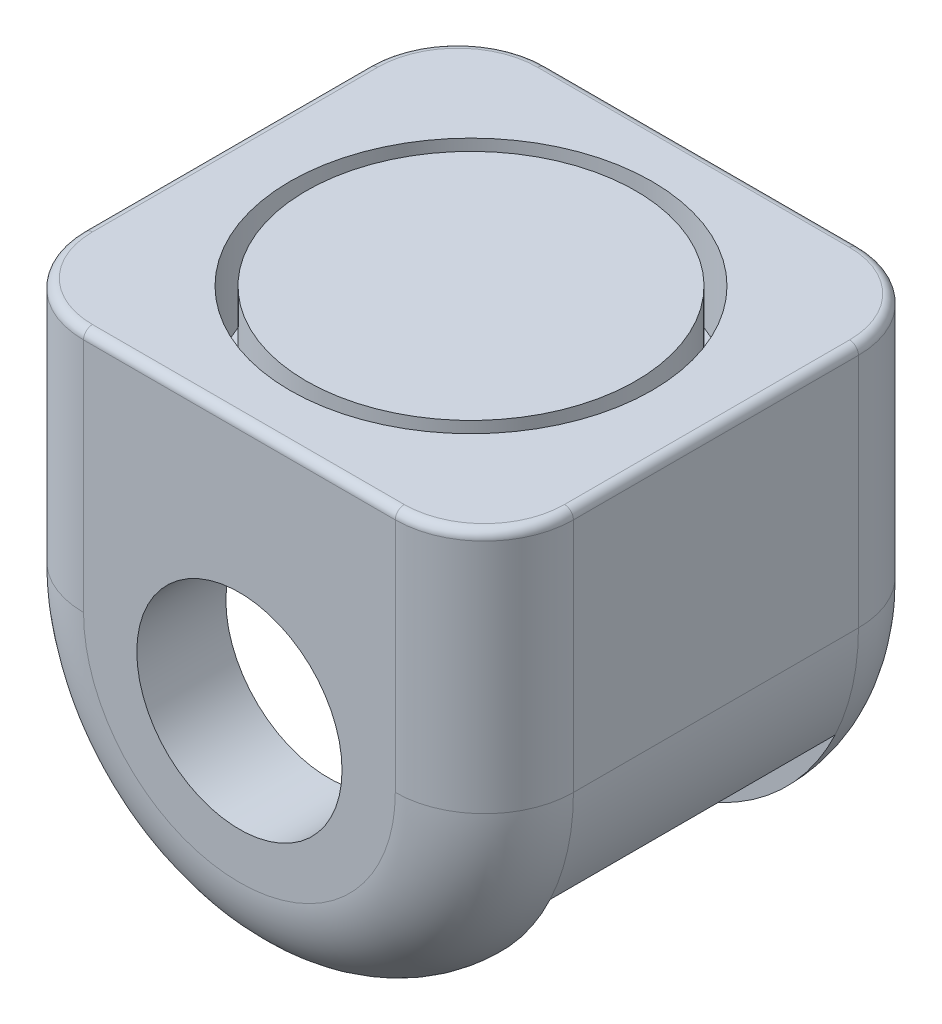
ISO-10303-21;
HEADER;
FILE_DESCRIPTION(('STEP AP214'),'2;1');
FILE_NAME('part.step','',(''),(''),'','','');
FILE_SCHEMA(('AUTOMOTIVE_DESIGN { 1 0 10303 214 1 1 1 1 }'));
ENDSEC;
DATA;
#1=APPLICATION_CONTEXT('core data for automotive mechanical design processes');
#2=APPLICATION_PROTOCOL_DEFINITION('international standard','automotive_design',2000,#1);
#3=PRODUCT_CONTEXT('',#1,'mechanical');
#4=PRODUCT('Part','Part','',(#3));
#5=PRODUCT_RELATED_PRODUCT_CATEGORY('part','',(#4));
#6=PRODUCT_DEFINITION_FORMATION('','',#4);
#7=PRODUCT_DEFINITION_CONTEXT('part definition',#1,'design');
#8=PRODUCT_DEFINITION('design','',#6,#7);
#9=PRODUCT_DEFINITION_SHAPE('','',#8);
#10=(LENGTH_UNIT() NAMED_UNIT(*) SI_UNIT(.MILLI.,.METRE.));
#11=(NAMED_UNIT(*) PLANE_ANGLE_UNIT() SI_UNIT($,.RADIAN.));
#12=(NAMED_UNIT(*) SI_UNIT($,.STERADIAN.) SOLID_ANGLE_UNIT());
#13=UNCERTAINTY_MEASURE_WITH_UNIT(LENGTH_MEASURE(1.E-05),#10,'distance_accuracy_value','');
#14=(GEOMETRIC_REPRESENTATION_CONTEXT(3) GLOBAL_UNCERTAINTY_ASSIGNED_CONTEXT((#13)) GLOBAL_UNIT_ASSIGNED_CONTEXT((#10,
#11,#12)) REPRESENTATION_CONTEXT('',''));
#15=CARTESIAN_POINT('',(0.,0.,0.));
#16=DIRECTION('',(0.,0.,1.));
#17=DIRECTION('',(1.,0.,0.));
#18=AXIS2_PLACEMENT_3D('',#15,#16,#17);
#19=CARTESIAN_POINT('',(0.,-27.5,26.));
#20=DIRECTION('',(0.,0.,-1.));
#21=DIRECTION('',(-1.,0.,0.));
#22=AXIS2_PLACEMENT_3D('',#19,#20,#21);
#23=CYLINDRICAL_SURFACE('',#22,27.5);
#24=CARTESIAN_POINT('',(0.,-27.5,-16.));
#25=DIRECTION('',(0.,0.,1.));
#26=DIRECTION('',(1.,0.,0.));
#27=AXIS2_PLACEMENT_3D('',#24,#25,#26);
#28=CIRCLE('',#27,27.5);
#29=CARTESIAN_POINT('',(-27.5,-27.5,-16.));
#30=VERTEX_POINT('',#29);
#31=CARTESIAN_POINT('',(-24.9070429299363,-39.1571528464849,-16.));
#32=VERTEX_POINT('',#31);
#33=EDGE_CURVE('E273',#30,#32,#28,.T.);
#34=ORIENTED_EDGE('',*,*,#33,.T.);
#35=DIRECTION('',(0.,0.,1.));
#36=VECTOR('',#35,1.);
#37=CARTESIAN_POINT('',(-24.9070429299363,-39.1571528464849,0.));
#38=LINE('',#37,#36);
#39=CARTESIAN_POINT('',(-24.9070429299363,-39.1571528464849,16.));
#40=VERTEX_POINT('',#39);
#41=EDGE_CURVE('E232',#32,#40,#38,.T.);
#42=ORIENTED_EDGE('',*,*,#41,.T.);
#43=CARTESIAN_POINT('',(0.,-27.5,16.));
#44=DIRECTION('',(0.,0.,1.));
#45=DIRECTION('',(1.,0.,0.));
#46=AXIS2_PLACEMENT_3D('',#43,#44,#45);
#47=CIRCLE('',#46,27.5);
#48=CARTESIAN_POINT('',(-27.5,-27.5,16.));
#49=VERTEX_POINT('',#48);
#50=EDGE_CURVE('E267',#40,#49,#47,.F.);
#51=ORIENTED_EDGE('',*,*,#50,.T.);
#52=DIRECTION('',(0.,0.,-1.));
#53=VECTOR('',#52,1.);
#54=CARTESIAN_POINT('',(-27.5,-27.5,26.));
#55=LINE('',#54,#53);
#56=EDGE_CURVE('E243',#49,#30,#55,.T.);
#57=ORIENTED_EDGE('',*,*,#56,.T.);
#58=EDGE_LOOP('',(#34,#42,#51,#57));
#59=FACE_BOUND('',#58,.T.);
#60=ADVANCED_FACE('F57',(#59),#23,.T.);
#61=CARTESIAN_POINT('',(27.5,-27.5,16.));
#62=VERTEX_POINT('',#61);
#63=CARTESIAN_POINT('',(24.8788818448915,-39.2171343829422,16.));
#64=VERTEX_POINT('',#63);
#65=EDGE_CURVE('E268',#62,#64,#47,.F.);
#66=ORIENTED_EDGE('',*,*,#65,.T.);
#67=DIRECTION('',(0.,0.,1.));
#68=VECTOR('',#67,1.);
#69=CARTESIAN_POINT('',(24.8788818448915,-39.2171343829422,0.));
#70=LINE('',#69,#68);
#71=CARTESIAN_POINT('',(24.8788818448915,-39.2171343829422,-16.));
#72=VERTEX_POINT('',#71);
#73=EDGE_CURVE('E225',#64,#72,#70,.F.);
#74=ORIENTED_EDGE('',*,*,#73,.T.);
#75=CARTESIAN_POINT('',(27.5,-27.5,-16.));
#76=VERTEX_POINT('',#75);
#77=EDGE_CURVE('E271',#72,#76,#28,.T.);
#78=ORIENTED_EDGE('',*,*,#77,.T.);
#79=DIRECTION('',(0.,0.,-1.));
#80=VECTOR('',#79,1.);
#81=CARTESIAN_POINT('',(27.5,-27.5,26.));
#82=LINE('',#81,#80);
#83=EDGE_CURVE('E252',#62,#76,#82,.T.);
#84=ORIENTED_EDGE('',*,*,#83,.F.);
#85=EDGE_LOOP('',(#66,#74,#78,#84));
#86=FACE_BOUND('',#85,.T.);
#87=ADVANCED_FACE('F419',(#86),#23,.T.);
#88=CARTESIAN_POINT('',(27.5,0.,26.));
#89=DIRECTION('',(-1.,0.,0.));
#90=DIRECTION('',(0.,-1.,0.));
#91=AXIS2_PLACEMENT_3D('',#88,#89,#90);
#92=PLANE('',#91);
#93=DIRECTION('',(0.,1.,0.));
#94=VECTOR('',#93,1.);
#95=CARTESIAN_POINT('',(27.5,0.,-16.));
#96=LINE('',#95,#94);
#97=CARTESIAN_POINT('',(27.5,-1.,-16.));
#98=VERTEX_POINT('',#97);
#99=EDGE_CURVE('E257',#76,#98,#96,.T.);
#100=ORIENTED_EDGE('',*,*,#99,.T.);
#101=DIRECTION('',(0.,0.,-1.));
#102=VECTOR('',#101,1.);
#103=CARTESIAN_POINT('',(27.5,-1.,26.));
#104=LINE('',#103,#102);
#105=CARTESIAN_POINT('',(27.5,-1.,16.));
#106=VERTEX_POINT('',#105);
#107=EDGE_CURVE('E66',#98,#106,#104,.F.);
#108=ORIENTED_EDGE('',*,*,#107,.T.);
#109=DIRECTION('',(0.,1.,0.));
#110=VECTOR('',#109,1.);
#111=CARTESIAN_POINT('',(27.5,-27.5,16.));
#112=LINE('',#111,#110);
#113=EDGE_CURVE('E255',#106,#62,#112,.F.);
#114=ORIENTED_EDGE('',*,*,#113,.T.);
#115=ORIENTED_EDGE('',*,*,#83,.T.);
#116=EDGE_LOOP('',(#100,#108,#114,#115));
#117=FACE_BOUND('',#116,.T.);
#118=ADVANCED_FACE('F365',(#117),#92,.F.);
#119=CARTESIAN_POINT('',(-27.5,0.,26.));
#120=DIRECTION('',(0.,-1.,0.));
#121=DIRECTION('',(0.,0.,-1.));
#122=AXIS2_PLACEMENT_3D('',#119,#120,#121);
#123=PLANE('',#122);
#124=CARTESIAN_POINT('',(-17.5,0.,16.));
#125=DIRECTION('',(0.,-1.,0.));
#126=DIRECTION('',(0.,0.,-1.));
#127=AXIS2_PLACEMENT_3D('',#124,#125,#126);
#128=CIRCLE('',#127,9.);
#129=CARTESIAN_POINT('',(-26.5,0.,16.));
#130=VERTEX_POINT('',#129);
#131=CARTESIAN_POINT('',(-17.5,0.,25.));
#132=VERTEX_POINT('',#131);
#133=EDGE_CURVE('E308',#130,#132,#128,.F.);
#134=ORIENTED_EDGE('',*,*,#133,.T.);
#135=DIRECTION('',(-1.,0.,0.));
#136=VECTOR('',#135,1.);
#137=CARTESIAN_POINT('',(17.5,0.,25.));
#138=LINE('',#137,#136);
#139=CARTESIAN_POINT('',(17.5,0.,25.));
#140=VERTEX_POINT('',#139);
#141=EDGE_CURVE('E315',#132,#140,#138,.F.);
#142=ORIENTED_EDGE('',*,*,#141,.T.);
#143=CARTESIAN_POINT('',(17.5,0.,16.));
#144=DIRECTION('',(0.,-1.,0.));
#145=DIRECTION('',(0.,0.,-1.));
#146=AXIS2_PLACEMENT_3D('',#143,#144,#145);
#147=CIRCLE('',#146,9.);
#148=CARTESIAN_POINT('',(26.5,0.,16.));
#149=VERTEX_POINT('',#148);
#150=EDGE_CURVE('E313',#140,#149,#147,.F.);
#151=ORIENTED_EDGE('',*,*,#150,.T.);
#152=DIRECTION('',(0.,0.,-1.));
#153=VECTOR('',#152,1.);
#154=CARTESIAN_POINT('',(26.5,0.,26.));
#155=LINE('',#154,#153);
#156=CARTESIAN_POINT('',(26.5,0.,-16.));
#157=VERTEX_POINT('',#156);
#158=EDGE_CURVE('E311',#149,#157,#155,.T.);
#159=ORIENTED_EDGE('',*,*,#158,.T.);
#160=CARTESIAN_POINT('',(17.5,0.,-16.));
#161=DIRECTION('',(0.,-1.,0.));
#162=DIRECTION('',(0.,0.,-1.));
#163=AXIS2_PLACEMENT_3D('',#160,#161,#162);
#164=CIRCLE('',#163,9.);
#165=CARTESIAN_POINT('',(17.5,0.,-25.));
#166=VERTEX_POINT('',#165);
#167=EDGE_CURVE('E306',#157,#166,#164,.F.);
#168=ORIENTED_EDGE('',*,*,#167,.T.);
#169=DIRECTION('',(-1.,0.,0.));
#170=VECTOR('',#169,1.);
#171=CARTESIAN_POINT('',(-27.5,0.,-25.));
#172=LINE('',#171,#170);
#173=CARTESIAN_POINT('',(-17.5,0.,-25.));
#174=VERTEX_POINT('',#173);
#175=EDGE_CURVE('E304',#166,#174,#172,.T.);
#176=ORIENTED_EDGE('',*,*,#175,.T.);
#177=CARTESIAN_POINT('',(-17.5,0.,-16.));
#178=DIRECTION('',(0.,-1.,0.));
#179=DIRECTION('',(0.,0.,-1.));
#180=AXIS2_PLACEMENT_3D('',#177,#178,#179);
#181=CIRCLE('',#180,9.);
#182=CARTESIAN_POINT('',(-26.5,0.,-16.));
#183=VERTEX_POINT('',#182);
#184=EDGE_CURVE('E302',#174,#183,#181,.F.);
#185=ORIENTED_EDGE('',*,*,#184,.T.);
#186=DIRECTION('',(0.,0.,-1.));
#187=VECTOR('',#186,1.);
#188=CARTESIAN_POINT('',(-26.5,0.,26.));
#189=LINE('',#188,#187);
#190=EDGE_CURVE('E288',#183,#130,#189,.F.);
#191=ORIENTED_EDGE('',*,*,#190,.T.);
#192=EDGE_LOOP('',(#134,#142,#151,#159,#168,#176,#185,#191));
#193=FACE_BOUND('',#192,.T.);
#194=CARTESIAN_POINT('',(0.,0.,0.));
#195=DIRECTION('',(0.,1.,0.));
#196=DIRECTION('',(0.,0.,1.));
#197=AXIS2_PLACEMENT_3D('',#194,#195,#196);
#198=CIRCLE('',#197,20.325);
#199=CARTESIAN_POINT('',(0.,0.,20.325));
#200=VERTEX_POINT('',#199);
#201=EDGE_CURVE('E244',#200,#200,#198,.T.);
#202=ORIENTED_EDGE('',*,*,#201,.F.);
#203=EDGE_LOOP('',(#202));
#204=FACE_BOUND('',#203,.T.);
#205=ADVANCED_FACE('F394',(#193,#204),#123,.F.);
#206=CARTESIAN_POINT('',(-27.5,-27.5,26.));
#207=DIRECTION('',(1.,0.,0.));
#208=DIRECTION('',(0.,1.,0.));
#209=AXIS2_PLACEMENT_3D('',#206,#207,#208);
#210=PLANE('',#209);
#211=DIRECTION('',(0.,-1.,0.));
#212=VECTOR('',#211,1.);
#213=CARTESIAN_POINT('',(-27.5,0.,16.));
#214=LINE('',#213,#212);
#215=CARTESIAN_POINT('',(-27.5,-1.,16.));
#216=VERTEX_POINT('',#215);
#217=EDGE_CURVE('E284',#49,#216,#214,.F.);
#218=ORIENTED_EDGE('',*,*,#217,.T.);
#219=DIRECTION('',(0.,0.,-1.));
#220=VECTOR('',#219,1.);
#221=CARTESIAN_POINT('',(-27.5,-1.,26.));
#222=LINE('',#221,#220);
#223=CARTESIAN_POINT('',(-27.5,-1.,-16.));
#224=VERTEX_POINT('',#223);
#225=EDGE_CURVE('E12',#216,#224,#222,.T.);
#226=ORIENTED_EDGE('',*,*,#225,.T.);
#227=DIRECTION('',(0.,-1.,0.));
#228=VECTOR('',#227,1.);
#229=CARTESIAN_POINT('',(-27.5,-27.5,-16.));
#230=LINE('',#229,#228);
#231=EDGE_CURVE('E286',#224,#30,#230,.T.);
#232=ORIENTED_EDGE('',*,*,#231,.T.);
#233=ORIENTED_EDGE('',*,*,#56,.F.);
#234=EDGE_LOOP('',(#218,#226,#232,#233));
#235=FACE_BOUND('',#234,.T.);
#236=ADVANCED_FACE('F427',(#235),#210,.F.);
#237=CARTESIAN_POINT('',(0.,-27.5,26.));
#238=DIRECTION('',(0.,0.,1.));
#239=DIRECTION('',(1.,0.,0.));
#240=AXIS2_PLACEMENT_3D('',#237,#238,#239);
#241=PLANE('',#240);
#242=CARTESIAN_POINT('',(0.,-28.3193180245492,26.));
#243=DIRECTION('',(0.,0.,1.));
#244=DIRECTION('',(1.,0.,0.));
#245=AXIS2_PLACEMENT_3D('',#242,#243,#244);
#246=CIRCLE('',#245,11.52);
#247=CARTESIAN_POINT('',(11.52,-28.3193180245492,26.));
#248=VERTEX_POINT('',#247);
#249=EDGE_CURVE('E746',#248,#248,#246,.T.);
#250=ORIENTED_EDGE('',*,*,#249,.F.);
#251=EDGE_LOOP('',(#250));
#252=FACE_BOUND('',#251,.T.);
#253=DIRECTION('',(0.,1.,0.));
#254=VECTOR('',#253,1.);
#255=CARTESIAN_POINT('',(17.5,0.,26.));
#256=LINE('',#255,#254);
#257=CARTESIAN_POINT('',(17.5,-27.5,26.));
#258=VERTEX_POINT('',#257);
#259=CARTESIAN_POINT('',(17.5,-1.,26.));
#260=VERTEX_POINT('',#259);
#261=EDGE_CURVE('E281',#258,#260,#256,.T.);
#262=ORIENTED_EDGE('',*,*,#261,.T.);
#263=DIRECTION('',(-1.,0.,0.));
#264=VECTOR('',#263,1.);
#265=CARTESIAN_POINT('',(-17.5,-1.,26.));
#266=LINE('',#265,#264);
#267=CARTESIAN_POINT('',(-17.5,-1.,26.));
#268=VERTEX_POINT('',#267);
#269=EDGE_CURVE('E320',#260,#268,#266,.T.);
#270=ORIENTED_EDGE('',*,*,#269,.T.);
#271=DIRECTION('',(0.,-1.,0.));
#272=VECTOR('',#271,1.);
#273=CARTESIAN_POINT('',(-17.5,-27.5,26.));
#274=LINE('',#273,#272);
#275=CARTESIAN_POINT('',(-17.5,-27.5,26.));
#276=VERTEX_POINT('',#275);
#277=EDGE_CURVE('E276',#268,#276,#274,.T.);
#278=ORIENTED_EDGE('',*,*,#277,.T.);
#279=CARTESIAN_POINT('',(0.,-27.5,26.));
#280=DIRECTION('',(0.,0.,1.));
#281=DIRECTION('',(1.,0.,0.));
#282=AXIS2_PLACEMENT_3D('',#279,#280,#281);
#283=CIRCLE('',#282,17.5);
#284=EDGE_CURVE('E279',#276,#258,#283,.T.);
#285=ORIENTED_EDGE('',*,*,#284,.T.);
#286=EDGE_LOOP('',(#262,#270,#278,#285));
#287=FACE_BOUND('',#286,.T.);
#288=ADVANCED_FACE('F410',(#252,#287),#241,.T.);
#289=CARTESIAN_POINT('',(0.,-27.5,-26.));
#290=DIRECTION('',(0.,0.,1.));
#291=DIRECTION('',(1.,0.,0.));
#292=AXIS2_PLACEMENT_3D('',#289,#290,#291);
#293=PLANE('',#292);
#294=CARTESIAN_POINT('',(0.,-28.3193180245492,-26.));
#295=DIRECTION('',(0.,0.,1.));
#296=DIRECTION('',(1.,0.,0.));
#297=AXIS2_PLACEMENT_3D('',#294,#295,#296);
#298=CIRCLE('',#297,11.52);
#299=CARTESIAN_POINT('',(11.52,-28.3193180245492,-26.));
#300=VERTEX_POINT('',#299);
#301=EDGE_CURVE('E216',#300,#300,#298,.T.);
#302=ORIENTED_EDGE('',*,*,#301,.T.);
#303=EDGE_LOOP('',(#302));
#304=FACE_BOUND('',#303,.T.);
#305=DIRECTION('',(0.,-1.,0.));
#306=VECTOR('',#305,1.);
#307=CARTESIAN_POINT('',(-17.5,-27.5,-26.));
#308=LINE('',#307,#306);
#309=CARTESIAN_POINT('',(-17.5,-27.5,-26.));
#310=VERTEX_POINT('',#309);
#311=CARTESIAN_POINT('',(-17.5,-1.,-26.));
#312=VERTEX_POINT('',#311);
#313=EDGE_CURVE('E260',#310,#312,#308,.F.);
#314=ORIENTED_EDGE('',*,*,#313,.T.);
#315=DIRECTION('',(-1.,0.,0.));
#316=VECTOR('',#315,1.);
#317=CARTESIAN_POINT('',(0.,-1.,-26.));
#318=LINE('',#317,#316);
#319=CARTESIAN_POINT('',(17.5,-1.,-26.));
#320=VERTEX_POINT('',#319);
#321=EDGE_CURVE('E326',#312,#320,#318,.F.);
#322=ORIENTED_EDGE('',*,*,#321,.T.);
#323=DIRECTION('',(0.,1.,0.));
#324=VECTOR('',#323,1.);
#325=CARTESIAN_POINT('',(17.5,-27.5,-26.));
#326=LINE('',#325,#324);
#327=CARTESIAN_POINT('',(17.5,-27.5,-26.));
#328=VERTEX_POINT('',#327);
#329=EDGE_CURVE('E265',#320,#328,#326,.F.);
#330=ORIENTED_EDGE('',*,*,#329,.T.);
#331=CARTESIAN_POINT('',(0.,-27.5,-26.));
#332=DIRECTION('',(0.,0.,1.));
#333=DIRECTION('',(1.,0.,0.));
#334=AXIS2_PLACEMENT_3D('',#331,#332,#333);
#335=CIRCLE('',#334,17.5);
#336=EDGE_CURVE('E263',#328,#310,#335,.F.);
#337=ORIENTED_EDGE('',*,*,#336,.T.);
#338=EDGE_LOOP('',(#314,#322,#330,#337));
#339=FACE_BOUND('',#338,.T.);
#340=ADVANCED_FACE('F380',(#304,#339),#293,.F.);
#341=CARTESIAN_POINT('',(0.,-10.,0.));
#342=DIRECTION('',(0.,1.,0.));
#343=DIRECTION('',(0.,0.,1.));
#344=AXIS2_PLACEMENT_3D('',#341,#342,#343);
#345=CYLINDRICAL_SURFACE('',#344,18.5);
#346=CARTESIAN_POINT('',(0.,-10.,0.));
#347=DIRECTION('',(0.,1.,0.));
#348=DIRECTION('',(0.,0.,1.));
#349=AXIS2_PLACEMENT_3D('',#346,#347,#348);
#350=CIRCLE('',#349,18.5);
#351=CARTESIAN_POINT('',(0.,-10.,18.5));
#352=VERTEX_POINT('',#351);
#353=EDGE_CURVE('E239',#352,#352,#350,.T.);
#354=ORIENTED_EDGE('',*,*,#353,.T.);
#355=EDGE_LOOP('',(#354));
#356=FACE_BOUND('',#355,.T.);
#357=CARTESIAN_POINT('',(0.,0.,0.));
#358=DIRECTION('',(0.,1.,0.));
#359=DIRECTION('',(0.,0.,1.));
#360=AXIS2_PLACEMENT_3D('',#357,#358,#359);
#361=CIRCLE('',#360,18.5);
#362=CARTESIAN_POINT('',(0.,0.,18.5));
#363=VERTEX_POINT('',#362);
#364=EDGE_CURVE('E240',#363,#363,#361,.T.);
#365=ORIENTED_EDGE('',*,*,#364,.F.);
#366=EDGE_LOOP('',(#365));
#367=FACE_BOUND('',#366,.T.);
#368=ADVANCED_FACE('F533',(#356,#367),#345,.T.);
#369=CARTESIAN_POINT('',(0.,-10.,0.));
#370=DIRECTION('',(0.,1.,0.));
#371=DIRECTION('',(0.,0.,1.));
#372=AXIS2_PLACEMENT_3D('',#369,#370,#371);
#373=CYLINDRICAL_SURFACE('',#372,20.325);
#374=CARTESIAN_POINT('',(0.,-10.,0.));
#375=DIRECTION('',(0.,1.,0.));
#376=DIRECTION('',(0.,0.,1.));
#377=AXIS2_PLACEMENT_3D('',#374,#375,#376);
#378=CIRCLE('',#377,20.325);
#379=CARTESIAN_POINT('',(0.,-10.,20.325));
#380=VERTEX_POINT('',#379);
#381=EDGE_CURVE('E236',#380,#380,#378,.T.);
#382=ORIENTED_EDGE('',*,*,#381,.F.);
#383=EDGE_LOOP('',(#382));
#384=FACE_BOUND('',#383,.T.);
#385=ORIENTED_EDGE('',*,*,#201,.T.);
#386=EDGE_LOOP('',(#385));
#387=FACE_BOUND('',#386,.T.);
#388=ADVANCED_FACE('F525',(#384,#387),#373,.F.);
#389=CARTESIAN_POINT('',(0.,-10.,0.));
#390=DIRECTION('',(0.,1.,0.));
#391=DIRECTION('',(0.,0.,1.));
#392=AXIS2_PLACEMENT_3D('',#389,#390,#391);
#393=PLANE('',#392);
#394=ORIENTED_EDGE('',*,*,#381,.T.);
#395=EDGE_LOOP('',(#394));
#396=FACE_BOUND('',#395,.T.);
#397=ORIENTED_EDGE('',*,*,#353,.F.);
#398=EDGE_LOOP('',(#397));
#399=FACE_BOUND('',#398,.T.);
#400=ADVANCED_FACE('F517',(#396,#399),#393,.T.);
#401=ORIENTED_EDGE('',*,*,#364,.T.);
#402=EDGE_LOOP('',(#401));
#403=FACE_BOUND('',#402,.T.);
#404=ADVANCED_FACE('F462',(#403),#123,.F.);
#405=CARTESIAN_POINT('',(-17.5,-27.5,-16.));
#406=DIRECTION('',(0.,-1.,0.));
#407=DIRECTION('',(1.,0.,0.));
#408=AXIS2_PLACEMENT_3D('',#405,#406,#407);
#409=CYLINDRICAL_SURFACE('',#408,10.);
#410=ORIENTED_EDGE('',*,*,#231,.F.);
#411=CARTESIAN_POINT('',(-17.5,-1.,-16.));
#412=DIRECTION('',(0.,-1.,0.));
#413=DIRECTION('',(0.,0.,-1.));
#414=AXIS2_PLACEMENT_3D('',#411,#412,#413);
#415=CIRCLE('',#414,10.);
#416=EDGE_CURVE('E328',#224,#312,#415,.T.);
#417=ORIENTED_EDGE('',*,*,#416,.T.);
#418=ORIENTED_EDGE('',*,*,#313,.F.);
#419=CARTESIAN_POINT('',(-17.5,-27.5,-16.));
#420=DIRECTION('',(0.,-1.,0.));
#421=DIRECTION('',(0.,0.,-1.));
#422=AXIS2_PLACEMENT_3D('',#419,#420,#421);
#423=CIRCLE('',#422,10.);
#424=EDGE_CURVE('E247',#30,#310,#423,.T.);
#425=ORIENTED_EDGE('',*,*,#424,.F.);
#426=EDGE_LOOP('',(#410,#417,#418,#425));
#427=FACE_BOUND('',#426,.T.);
#428=ADVANCED_FACE('F382',(#427),#409,.T.);
#429=CARTESIAN_POINT('',(0.,-27.5,-16.));
#430=DIRECTION('',(0.,0.,1.));
#431=DIRECTION('',(1.,0.,0.));
#432=AXIS2_PLACEMENT_3D('',#429,#430,#431);
#433=TOROIDAL_SURFACE('',#432,17.5,10.);
#434=ORIENTED_EDGE('',*,*,#424,.T.);
#435=ORIENTED_EDGE('',*,*,#336,.F.);
#436=CARTESIAN_POINT('',(17.5,-27.5,-16.));
#437=DIRECTION('',(0.,1.,0.));
#438=DIRECTION('',(0.,0.,1.));
#439=AXIS2_PLACEMENT_3D('',#436,#437,#438);
#440=CIRCLE('',#439,10.);
#441=EDGE_CURVE('E289',#76,#328,#440,.T.);
#442=ORIENTED_EDGE('',*,*,#441,.F.);
#443=ORIENTED_EDGE('',*,*,#77,.F.);
#444=EDGE_CURVE('E277',#32,#72,#28,.T.);
#445=ORIENTED_EDGE('',*,*,#444,.F.);
#446=ORIENTED_EDGE('',*,*,#33,.F.);
#447=EDGE_LOOP('',(#434,#435,#442,#443,#445,#446));
#448=FACE_BOUND('',#447,.T.);
#449=ADVANCED_FACE('F374',(#448),#433,.T.);
#450=CARTESIAN_POINT('',(17.5,0.,-16.));
#451=DIRECTION('',(0.,1.,0.));
#452=DIRECTION('',(-1.,0.,0.));
#453=AXIS2_PLACEMENT_3D('',#450,#451,#452);
#454=CYLINDRICAL_SURFACE('',#453,10.);
#455=ORIENTED_EDGE('',*,*,#329,.F.);
#456=CARTESIAN_POINT('',(17.5,-1.,-16.));
#457=DIRECTION('',(0.,-1.,0.));
#458=DIRECTION('',(0.,0.,-1.));
#459=AXIS2_PLACEMENT_3D('',#456,#457,#458);
#460=CIRCLE('',#459,10.);
#461=EDGE_CURVE('E324',#320,#98,#460,.T.);
#462=ORIENTED_EDGE('',*,*,#461,.T.);
#463=ORIENTED_EDGE('',*,*,#99,.F.);
#464=ORIENTED_EDGE('',*,*,#441,.T.);
#465=EDGE_LOOP('',(#455,#462,#463,#464));
#466=FACE_BOUND('',#465,.T.);
#467=ADVANCED_FACE('F363',(#466),#454,.T.);
#468=CARTESIAN_POINT('',(-17.5,-27.5,16.));
#469=DIRECTION('',(0.,1.,0.));
#470=DIRECTION('',(-1.,0.,0.));
#471=AXIS2_PLACEMENT_3D('',#468,#469,#470);
#472=CYLINDRICAL_SURFACE('',#471,10.);
#473=ORIENTED_EDGE('',*,*,#277,.F.);
#474=CARTESIAN_POINT('',(-17.5,-1.,16.));
#475=DIRECTION('',(0.,-1.,0.));
#476=DIRECTION('',(0.,0.,-1.));
#477=AXIS2_PLACEMENT_3D('',#474,#475,#476);
#478=CIRCLE('',#477,10.);
#479=EDGE_CURVE('E317',#268,#216,#478,.T.);
#480=ORIENTED_EDGE('',*,*,#479,.T.);
#481=ORIENTED_EDGE('',*,*,#217,.F.);
#482=CARTESIAN_POINT('',(-17.5,-27.5,16.));
#483=DIRECTION('',(0.,-1.,0.));
#484=DIRECTION('',(0.,0.,-1.));
#485=AXIS2_PLACEMENT_3D('',#482,#483,#484);
#486=CIRCLE('',#485,10.);
#487=EDGE_CURVE('E292',#276,#49,#486,.T.);
#488=ORIENTED_EDGE('',*,*,#487,.F.);
#489=EDGE_LOOP('',(#473,#480,#481,#488));
#490=FACE_BOUND('',#489,.T.);
#491=ADVANCED_FACE('F429',(#490),#472,.T.);
#492=CARTESIAN_POINT('',(0.,-27.5,16.));
#493=DIRECTION('',(0.,0.,1.));
#494=DIRECTION('',(1.,0.,0.));
#495=AXIS2_PLACEMENT_3D('',#492,#493,#494);
#496=TOROIDAL_SURFACE('',#495,17.5,10.);
#497=ORIENTED_EDGE('',*,*,#487,.T.);
#498=ORIENTED_EDGE('',*,*,#50,.F.);
#499=EDGE_CURVE('E272',#64,#40,#47,.F.);
#500=ORIENTED_EDGE('',*,*,#499,.F.);
#501=ORIENTED_EDGE('',*,*,#65,.F.);
#502=CARTESIAN_POINT('',(17.5,-27.5,16.));
#503=DIRECTION('',(0.,1.,0.));
#504=DIRECTION('',(0.,0.,1.));
#505=AXIS2_PLACEMENT_3D('',#502,#503,#504);
#506=CIRCLE('',#505,10.);
#507=EDGE_CURVE('E295',#258,#62,#506,.T.);
#508=ORIENTED_EDGE('',*,*,#507,.F.);
#509=ORIENTED_EDGE('',*,*,#284,.F.);
#510=EDGE_LOOP('',(#497,#498,#500,#501,#508,#509));
#511=FACE_BOUND('',#510,.T.);
#512=ADVANCED_FACE('F416',(#511),#496,.T.);
#513=CARTESIAN_POINT('',(17.5,-27.5,16.));
#514=DIRECTION('',(0.,-1.,0.));
#515=DIRECTION('',(1.,0.,0.));
#516=AXIS2_PLACEMENT_3D('',#513,#514,#515);
#517=CYLINDRICAL_SURFACE('',#516,10.);
#518=ORIENTED_EDGE('',*,*,#113,.F.);
#519=CARTESIAN_POINT('',(17.5,-1.,16.));
#520=DIRECTION('',(0.,-1.,0.));
#521=DIRECTION('',(0.,0.,-1.));
#522=AXIS2_PLACEMENT_3D('',#519,#520,#521);
#523=CIRCLE('',#522,10.);
#524=EDGE_CURVE('E322',#106,#260,#523,.T.);
#525=ORIENTED_EDGE('',*,*,#524,.T.);
#526=ORIENTED_EDGE('',*,*,#261,.F.);
#527=ORIENTED_EDGE('',*,*,#507,.T.);
#528=EDGE_LOOP('',(#518,#525,#526,#527));
#529=FACE_BOUND('',#528,.T.);
#530=ADVANCED_FACE('F408',(#529),#517,.T.);
#531=CARTESIAN_POINT('',(17.5,-1.,-16.));
#532=DIRECTION('',(0.,-1.,0.));
#533=DIRECTION('',(0.,0.,-1.));
#534=AXIS2_PLACEMENT_3D('',#531,#532,#533);
#535=TOROIDAL_SURFACE('',#534,9.,1.);
#536=CARTESIAN_POINT('',(26.5,-0.999999999999999,-16.));
#537=DIRECTION('',(0.,0.,1.));
#538=DIRECTION('',(1.,0.,0.));
#539=AXIS2_PLACEMENT_3D('',#536,#537,#538);
#540=CIRCLE('',#539,1.);
#541=EDGE_CURVE('E346',#98,#157,#540,.T.);
#542=ORIENTED_EDGE('',*,*,#541,.F.);
#543=ORIENTED_EDGE('',*,*,#461,.F.);
#544=CARTESIAN_POINT('',(17.5,-1.,-25.));
#545=DIRECTION('',(-1.,0.,0.));
#546=DIRECTION('',(0.,0.,1.));
#547=AXIS2_PLACEMENT_3D('',#544,#545,#546);
#548=CIRCLE('',#547,1.);
#549=EDGE_CURVE('E298',#166,#320,#548,.T.);
#550=ORIENTED_EDGE('',*,*,#549,.F.);
#551=ORIENTED_EDGE('',*,*,#167,.F.);
#552=EDGE_LOOP('',(#542,#543,#550,#551));
#553=FACE_BOUND('',#552,.T.);
#554=ADVANCED_FACE('F59',(#553),#535,.T.);
#555=CARTESIAN_POINT('',(-27.5,-1.,-25.));
#556=DIRECTION('',(-1.,0.,0.));
#557=DIRECTION('',(0.,0.,1.));
#558=AXIS2_PLACEMENT_3D('',#555,#556,#557);
#559=CYLINDRICAL_SURFACE('',#558,1.);
#560=ORIENTED_EDGE('',*,*,#549,.T.);
#561=ORIENTED_EDGE('',*,*,#321,.F.);
#562=CARTESIAN_POINT('',(-17.5,-1.,-25.));
#563=DIRECTION('',(-1.,0.,0.));
#564=DIRECTION('',(0.,0.,1.));
#565=AXIS2_PLACEMENT_3D('',#562,#563,#564);
#566=CIRCLE('',#565,1.);
#567=EDGE_CURVE('E343',#174,#312,#566,.T.);
#568=ORIENTED_EDGE('',*,*,#567,.F.);
#569=ORIENTED_EDGE('',*,*,#175,.F.);
#570=EDGE_LOOP('',(#560,#561,#568,#569));
#571=FACE_BOUND('',#570,.T.);
#572=ADVANCED_FACE('F353',(#571),#559,.T.);
#573=CARTESIAN_POINT('',(26.5,-1.,26.));
#574=DIRECTION('',(0.,0.,-1.));
#575=DIRECTION('',(-1.,0.,0.));
#576=AXIS2_PLACEMENT_3D('',#573,#574,#575);
#577=CYLINDRICAL_SURFACE('',#576,1.);
#578=ORIENTED_EDGE('',*,*,#541,.T.);
#579=ORIENTED_EDGE('',*,*,#158,.F.);
#580=CARTESIAN_POINT('',(26.5,-1.,16.));
#581=DIRECTION('',(0.,0.,1.));
#582=DIRECTION('',(1.,0.,0.));
#583=AXIS2_PLACEMENT_3D('',#580,#581,#582);
#584=CIRCLE('',#583,1.);
#585=EDGE_CURVE('E340',#106,#149,#584,.T.);
#586=ORIENTED_EDGE('',*,*,#585,.F.);
#587=ORIENTED_EDGE('',*,*,#107,.F.);
#588=EDGE_LOOP('',(#578,#579,#586,#587));
#589=FACE_BOUND('',#588,.T.);
#590=ADVANCED_FACE('F400',(#589),#577,.T.);
#591=CARTESIAN_POINT('',(-17.5,-1.,-16.));
#592=DIRECTION('',(0.,-1.,0.));
#593=DIRECTION('',(0.,0.,-1.));
#594=AXIS2_PLACEMENT_3D('',#591,#592,#593);
#595=TOROIDAL_SURFACE('',#594,9.,1.);
#596=ORIENTED_EDGE('',*,*,#567,.T.);
#597=ORIENTED_EDGE('',*,*,#416,.F.);
#598=CARTESIAN_POINT('',(-26.5,-1.,-16.));
#599=DIRECTION('',(0.,0.,1.));
#600=DIRECTION('',(1.,0.,0.));
#601=AXIS2_PLACEMENT_3D('',#598,#599,#600);
#602=CIRCLE('',#601,1.);
#603=EDGE_CURVE('E337',#183,#224,#602,.T.);
#604=ORIENTED_EDGE('',*,*,#603,.F.);
#605=ORIENTED_EDGE('',*,*,#184,.F.);
#606=EDGE_LOOP('',(#596,#597,#604,#605));
#607=FACE_BOUND('',#606,.T.);
#608=ADVANCED_FACE('F386',(#607),#595,.T.);
#609=CARTESIAN_POINT('',(17.5,-1.,16.));
#610=DIRECTION('',(0.,-1.,0.));
#611=DIRECTION('',(0.,0.,-1.));
#612=AXIS2_PLACEMENT_3D('',#609,#610,#611);
#613=TOROIDAL_SURFACE('',#612,9.,1.);
#614=ORIENTED_EDGE('',*,*,#585,.T.);
#615=ORIENTED_EDGE('',*,*,#150,.F.);
#616=CARTESIAN_POINT('',(17.5,-1.,25.));
#617=DIRECTION('',(-1.,0.,0.));
#618=DIRECTION('',(0.,0.,1.));
#619=AXIS2_PLACEMENT_3D('',#616,#617,#618);
#620=CIRCLE('',#619,1.);
#621=EDGE_CURVE('E334',#260,#140,#620,.T.);
#622=ORIENTED_EDGE('',*,*,#621,.F.);
#623=ORIENTED_EDGE('',*,*,#524,.F.);
#624=EDGE_LOOP('',(#614,#615,#622,#623));
#625=FACE_BOUND('',#624,.T.);
#626=ADVANCED_FACE('F403',(#625),#613,.T.);
#627=CARTESIAN_POINT('',(-26.5,-1.,26.));
#628=DIRECTION('',(0.,0.,-1.));
#629=DIRECTION('',(-1.,0.,0.));
#630=AXIS2_PLACEMENT_3D('',#627,#628,#629);
#631=CYLINDRICAL_SURFACE('',#630,1.);
#632=ORIENTED_EDGE('',*,*,#603,.T.);
#633=ORIENTED_EDGE('',*,*,#225,.F.);
#634=CARTESIAN_POINT('',(-26.5,-1.,16.));
#635=DIRECTION('',(0.,0.,1.));
#636=DIRECTION('',(1.,0.,0.));
#637=AXIS2_PLACEMENT_3D('',#634,#635,#636);
#638=CIRCLE('',#637,1.);
#639=EDGE_CURVE('E332',#130,#216,#638,.T.);
#640=ORIENTED_EDGE('',*,*,#639,.F.);
#641=ORIENTED_EDGE('',*,*,#190,.F.);
#642=EDGE_LOOP('',(#632,#633,#640,#641));
#643=FACE_BOUND('',#642,.T.);
#644=ADVANCED_FACE('F390',(#643),#631,.T.);
#645=CARTESIAN_POINT('',(0.,-1.,25.));
#646=DIRECTION('',(1.,0.,0.));
#647=DIRECTION('',(0.,0.,-1.));
#648=AXIS2_PLACEMENT_3D('',#645,#646,#647);
#649=CYLINDRICAL_SURFACE('',#648,1.);
#650=ORIENTED_EDGE('',*,*,#621,.T.);
#651=ORIENTED_EDGE('',*,*,#141,.F.);
#652=CARTESIAN_POINT('',(-17.5,-1.,25.));
#653=DIRECTION('',(-1.,0.,0.));
#654=DIRECTION('',(0.,0.,1.));
#655=AXIS2_PLACEMENT_3D('',#652,#653,#654);
#656=CIRCLE('',#655,1.);
#657=EDGE_CURVE('E235',#268,#132,#656,.T.);
#658=ORIENTED_EDGE('',*,*,#657,.F.);
#659=ORIENTED_EDGE('',*,*,#269,.F.);
#660=EDGE_LOOP('',(#650,#651,#658,#659));
#661=FACE_BOUND('',#660,.T.);
#662=ADVANCED_FACE('F443',(#661),#649,.T.);
#663=CARTESIAN_POINT('',(-17.5,-1.,16.));
#664=DIRECTION('',(0.,-1.,0.));
#665=DIRECTION('',(0.,0.,-1.));
#666=AXIS2_PLACEMENT_3D('',#663,#664,#665);
#667=TOROIDAL_SURFACE('',#666,9.,1.);
#668=ORIENTED_EDGE('',*,*,#639,.T.);
#669=ORIENTED_EDGE('',*,*,#479,.F.);
#670=ORIENTED_EDGE('',*,*,#657,.T.);
#671=ORIENTED_EDGE('',*,*,#133,.F.);
#672=EDGE_LOOP('',(#668,#669,#670,#671));
#673=FACE_BOUND('',#672,.T.);
#674=ADVANCED_FACE('F436',(#673),#667,.T.);
#675=CARTESIAN_POINT('',(-0.01129658907182,-36.8764042563652,-16.));
#676=DIRECTION('',(0.,0.,1.));
#677=DIRECTION('',(1.,0.,0.));
#678=AXIS2_PLACEMENT_3D('',#675,#676,#677);
#679=CYLINDRICAL_SURFACE('',#678,25.);
#680=CARTESIAN_POINT('',(-0.01129658907182,-36.8764042563652,-16.));
#681=DIRECTION('',(0.,0.,1.));
#682=DIRECTION('',(1.,0.,0.));
#683=AXIS2_PLACEMENT_3D('',#680,#681,#682);
#684=CIRCLE('',#683,25.);
#685=CARTESIAN_POINT('',(-25.0112965890718,-36.8764042563652,-16.));
#686=VERTEX_POINT('',#685);
#687=EDGE_CURVE('E209',#686,#32,#684,.T.);
#688=ORIENTED_EDGE('',*,*,#687,.F.);
#689=DIRECTION('',(0.,0.,1.));
#690=VECTOR('',#689,1.);
#691=CARTESIAN_POINT('',(-25.0112965890718,-36.8764042563652,-16.));
#692=LINE('',#691,#690);
#693=CARTESIAN_POINT('',(-25.0112965890718,-36.8764042563652,16.));
#694=VERTEX_POINT('',#693);
#695=EDGE_CURVE('E203',#686,#694,#692,.T.);
#696=ORIENTED_EDGE('',*,*,#695,.T.);
#697=CARTESIAN_POINT('',(-0.01129658907182,-36.8764042563652,16.));
#698=DIRECTION('',(0.,0.,1.));
#699=DIRECTION('',(1.,0.,0.));
#700=AXIS2_PLACEMENT_3D('',#697,#698,#699);
#701=CIRCLE('',#700,25.);
#702=EDGE_CURVE('E218',#694,#40,#701,.T.);
#703=ORIENTED_EDGE('',*,*,#702,.T.);
#704=ORIENTED_EDGE('',*,*,#41,.F.);
#705=EDGE_LOOP('',(#688,#696,#703,#704));
#706=FACE_BOUND('',#705,.T.);
#707=ADVANCED_FACE('F434',(#706),#679,.F.);
#708=CARTESIAN_POINT('',(24.9887034109282,-36.8764042563652,16.));
#709=VERTEX_POINT('',#708);
#710=EDGE_CURVE('E74',#64,#709,#701,.T.);
#711=ORIENTED_EDGE('',*,*,#710,.T.);
#712=DIRECTION('',(0.,0.,1.));
#713=VECTOR('',#712,1.);
#714=CARTESIAN_POINT('',(24.9887034109282,-36.8764042563652,-16.));
#715=LINE('',#714,#713);
#716=CARTESIAN_POINT('',(24.9887034109282,-36.8764042563652,-16.));
#717=VERTEX_POINT('',#716);
#718=EDGE_CURVE('E226',#717,#709,#715,.T.);
#719=ORIENTED_EDGE('',*,*,#718,.F.);
#720=EDGE_CURVE('E207',#72,#717,#684,.T.);
#721=ORIENTED_EDGE('',*,*,#720,.F.);
#722=ORIENTED_EDGE('',*,*,#73,.F.);
#723=EDGE_LOOP('',(#711,#719,#721,#722));
#724=FACE_BOUND('',#723,.T.);
#725=ADVANCED_FACE('F422',(#724),#679,.F.);
#726=CARTESIAN_POINT('',(24.9887034109282,-36.8764042563652,-16.));
#727=DIRECTION('',(1.,0.,0.));
#728=DIRECTION('',(0.,0.,-1.));
#729=AXIS2_PLACEMENT_3D('',#726,#727,#728);
#730=PLANE('',#729);
#731=DIRECTION('',(0.,1.,0.));
#732=VECTOR('',#731,1.);
#733=CARTESIAN_POINT('',(24.9887034109282,-36.8764042563652,16.));
#734=LINE('',#733,#732);
#735=CARTESIAN_POINT('',(24.9887034109282,-11.8764042563652,16.));
#736=VERTEX_POINT('',#735);
#737=EDGE_CURVE('E194',#709,#736,#734,.T.);
#738=ORIENTED_EDGE('',*,*,#737,.T.);
#739=DIRECTION('',(0.,0.,1.));
#740=VECTOR('',#739,1.);
#741=CARTESIAN_POINT('',(24.9887034109282,-11.8764042563652,-16.));
#742=LINE('',#741,#740);
#743=CARTESIAN_POINT('',(24.9887034109282,-11.8764042563652,-16.));
#744=VERTEX_POINT('',#743);
#745=EDGE_CURVE('E223',#744,#736,#742,.T.);
#746=ORIENTED_EDGE('',*,*,#745,.F.);
#747=DIRECTION('',(0.,1.,0.));
#748=VECTOR('',#747,1.);
#749=CARTESIAN_POINT('',(24.9887034109282,-36.8764042563652,-16.));
#750=LINE('',#749,#748);
#751=EDGE_CURVE('E191',#717,#744,#750,.T.);
#752=ORIENTED_EDGE('',*,*,#751,.F.);
#753=ORIENTED_EDGE('',*,*,#718,.T.);
#754=EDGE_LOOP('',(#738,#746,#752,#753));
#755=FACE_BOUND('',#754,.T.);
#756=ADVANCED_FACE('F442',(#755),#730,.F.);
#757=CARTESIAN_POINT('',(-25.0112965890718,-11.8764042563652,-16.));
#758=DIRECTION('',(-1.,0.,0.));
#759=DIRECTION('',(0.,0.,1.));
#760=AXIS2_PLACEMENT_3D('',#757,#758,#759);
#761=PLANE('',#760);
#762=DIRECTION('',(0.,-1.,0.));
#763=VECTOR('',#762,1.);
#764=CARTESIAN_POINT('',(-25.0112965890718,-11.8764042563652,16.));
#765=LINE('',#764,#763);
#766=CARTESIAN_POINT('',(-25.0112965890718,-11.8764042563652,16.));
#767=VERTEX_POINT('',#766);
#768=EDGE_CURVE('E215',#767,#694,#765,.T.);
#769=ORIENTED_EDGE('',*,*,#768,.T.);
#770=ORIENTED_EDGE('',*,*,#695,.F.);
#771=DIRECTION('',(0.,-1.,0.));
#772=VECTOR('',#771,1.);
#773=CARTESIAN_POINT('',(-25.0112965890718,-11.8764042563652,-16.));
#774=LINE('',#773,#772);
#775=CARTESIAN_POINT('',(-25.0112965890718,-11.8764042563652,-16.));
#776=VERTEX_POINT('',#775);
#777=EDGE_CURVE('E189',#776,#686,#774,.T.);
#778=ORIENTED_EDGE('',*,*,#777,.F.);
#779=DIRECTION('',(0.,0.,1.));
#780=VECTOR('',#779,1.);
#781=CARTESIAN_POINT('',(-25.0112965890718,-11.8764042563652,-16.));
#782=LINE('',#781,#780);
#783=EDGE_CURVE('E197',#776,#767,#782,.T.);
#784=ORIENTED_EDGE('',*,*,#783,.T.);
#785=EDGE_LOOP('',(#769,#770,#778,#784));
#786=FACE_BOUND('',#785,.T.);
#787=ADVANCED_FACE('F205',(#786),#761,.F.);
#788=CARTESIAN_POINT('',(-0.0112965890718231,-11.8764042563652,-16.));
#789=DIRECTION('',(0.,1.,0.));
#790=DIRECTION('',(-1.,0.,0.));
#791=AXIS2_PLACEMENT_3D('',#788,#789,#790);
#792=PLANE('',#791);
#793=DIRECTION('',(-1.,0.,0.));
#794=VECTOR('',#793,1.);
#795=CARTESIAN_POINT('',(-0.0112965890718231,-11.8764042563652,16.));
#796=LINE('',#795,#794);
#797=EDGE_CURVE('E199',#736,#767,#796,.T.);
#798=ORIENTED_EDGE('',*,*,#797,.T.);
#799=ORIENTED_EDGE('',*,*,#783,.F.);
#800=DIRECTION('',(-1.,0.,0.));
#801=VECTOR('',#800,1.);
#802=CARTESIAN_POINT('',(24.9887034109282,-11.8764042563652,-16.));
#803=LINE('',#802,#801);
#804=EDGE_CURVE('E184',#744,#776,#803,.T.);
#805=ORIENTED_EDGE('',*,*,#804,.F.);
#806=ORIENTED_EDGE('',*,*,#745,.T.);
#807=EDGE_LOOP('',(#798,#799,#805,#806));
#808=FACE_BOUND('',#807,.T.);
#809=ADVANCED_FACE('F198',(#808),#792,.F.);
#810=CARTESIAN_POINT('',(-0.01129658907182,-36.8764042563652,-16.));
#811=DIRECTION('',(0.,0.,1.));
#812=DIRECTION('',(1.,0.,0.));
#813=AXIS2_PLACEMENT_3D('',#810,#811,#812);
#814=PLANE('',#813);
#815=CARTESIAN_POINT('',(0.,-28.3193180245492,-16.));
#816=DIRECTION('',(0.,0.,1.));
#817=DIRECTION('',(1.,0.,0.));
#818=AXIS2_PLACEMENT_3D('',#815,#816,#817);
#819=CIRCLE('',#818,11.52);
#820=CARTESIAN_POINT('',(11.52,-28.3193180245492,-16.));
#821=VERTEX_POINT('',#820);
#822=EDGE_CURVE('E741',#821,#821,#819,.T.);
#823=ORIENTED_EDGE('',*,*,#822,.F.);
#824=EDGE_LOOP('',(#823));
#825=FACE_BOUND('',#824,.T.);
#826=ORIENTED_EDGE('',*,*,#720,.T.);
#827=ORIENTED_EDGE('',*,*,#751,.T.);
#828=ORIENTED_EDGE('',*,*,#804,.T.);
#829=ORIENTED_EDGE('',*,*,#777,.T.);
#830=ORIENTED_EDGE('',*,*,#687,.T.);
#831=ORIENTED_EDGE('',*,*,#444,.T.);
#832=EDGE_LOOP('',(#826,#827,#828,#829,#830,#831));
#833=FACE_BOUND('',#832,.T.);
#834=ADVANCED_FACE('F186',(#825,#833),#814,.T.);
#835=CARTESIAN_POINT('',(-0.01129658907182,-36.8764042563652,16.));
#836=DIRECTION('',(0.,0.,1.));
#837=DIRECTION('',(1.,0.,0.));
#838=AXIS2_PLACEMENT_3D('',#835,#836,#837);
#839=PLANE('',#838);
#840=CARTESIAN_POINT('',(0.,-28.3193180245492,16.));
#841=DIRECTION('',(0.,0.,1.));
#842=DIRECTION('',(1.,0.,0.));
#843=AXIS2_PLACEMENT_3D('',#840,#841,#842);
#844=CIRCLE('',#843,11.52);
#845=CARTESIAN_POINT('',(11.52,-28.3193180245492,16.));
#846=VERTEX_POINT('',#845);
#847=EDGE_CURVE('E61',#846,#846,#844,.T.);
#848=ORIENTED_EDGE('',*,*,#847,.T.);
#849=EDGE_LOOP('',(#848));
#850=FACE_BOUND('',#849,.T.);
#851=ORIENTED_EDGE('',*,*,#499,.T.);
#852=ORIENTED_EDGE('',*,*,#702,.F.);
#853=ORIENTED_EDGE('',*,*,#768,.F.);
#854=ORIENTED_EDGE('',*,*,#797,.F.);
#855=ORIENTED_EDGE('',*,*,#737,.F.);
#856=ORIENTED_EDGE('',*,*,#710,.F.);
#857=EDGE_LOOP('',(#851,#852,#853,#854,#855,#856));
#858=FACE_BOUND('',#857,.T.);
#859=ADVANCED_FACE('F432',(#850,#858),#839,.F.);
#860=CARTESIAN_POINT('',(0.,-28.3193180245492,-49.));
#861=DIRECTION('',(0.,0.,1.));
#862=DIRECTION('',(1.,0.,0.));
#863=AXIS2_PLACEMENT_3D('',#860,#861,#862);
#864=CYLINDRICAL_SURFACE('',#863,11.52);
#865=ORIENTED_EDGE('',*,*,#249,.T.);
#866=EDGE_LOOP('',(#865));
#867=FACE_BOUND('',#866,.T.);
#868=ORIENTED_EDGE('',*,*,#847,.F.);
#869=EDGE_LOOP('',(#868));
#870=FACE_BOUND('',#869,.T.);
#871=ADVANCED_FACE('F711',(#867,#870),#864,.F.);
#872=ORIENTED_EDGE('',*,*,#822,.T.);
#873=EDGE_LOOP('',(#872));
#874=FACE_BOUND('',#873,.T.);
#875=ORIENTED_EDGE('',*,*,#301,.F.);
#876=EDGE_LOOP('',(#875));
#877=FACE_BOUND('',#876,.T.);
#878=ADVANCED_FACE('F720',(#874,#877),#864,.F.);
#879=CLOSED_SHELL('',(#60,#87,#118,#205,#236,#288,#340,#368,#388,#400,#404,#428,#449,#467,#491,
#512,#530,#554,#572,#590,#608,#626,#644,#662,#674,#707,#725,#756,#787,#809,#834,#859,#871,#878));
#880=MANIFOLD_SOLID_BREP('B2',#879);
#881=ADVANCED_BREP_SHAPE_REPRESENTATION('',(#18,#880),#14);
#882=SHAPE_DEFINITION_REPRESENTATION(#9,#881);
ENDSEC;
END-ISO-10303-21;
